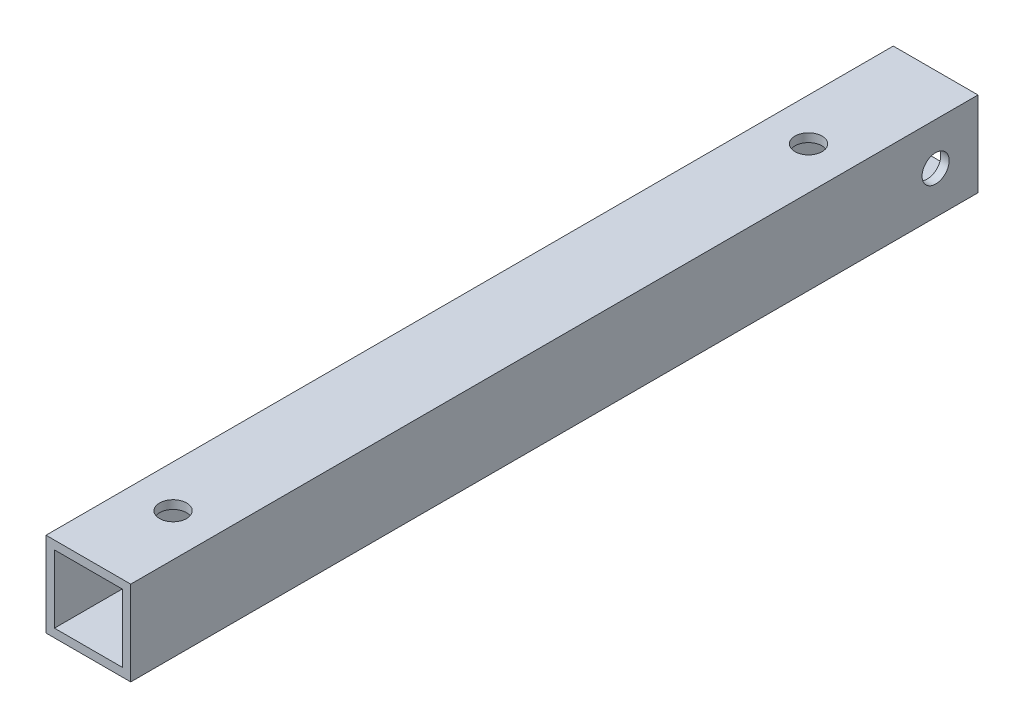
ISO-10303-21;
HEADER;
FILE_DESCRIPTION(('STEP AP214'),'2;1');
FILE_NAME('part.step','',(''),(''),'','','');
FILE_SCHEMA(('AUTOMOTIVE_DESIGN { 1 0 10303 214 1 1 1 1 }'));
ENDSEC;
DATA;
#1=APPLICATION_CONTEXT('core data for automotive mechanical design processes');
#2=APPLICATION_PROTOCOL_DEFINITION('international standard','automotive_design',2000,#1);
#3=PRODUCT_CONTEXT('',#1,'mechanical');
#4=PRODUCT('Part','Part','',(#3));
#5=PRODUCT_RELATED_PRODUCT_CATEGORY('part','',(#4));
#6=PRODUCT_DEFINITION_FORMATION('','',#4);
#7=PRODUCT_DEFINITION_CONTEXT('part definition',#1,'design');
#8=PRODUCT_DEFINITION('design','',#6,#7);
#9=PRODUCT_DEFINITION_SHAPE('','',#8);
#10=(LENGTH_UNIT() NAMED_UNIT(*) SI_UNIT(.MILLI.,.METRE.));
#11=(NAMED_UNIT(*) PLANE_ANGLE_UNIT() SI_UNIT($,.RADIAN.));
#12=(NAMED_UNIT(*) SI_UNIT($,.STERADIAN.) SOLID_ANGLE_UNIT());
#13=UNCERTAINTY_MEASURE_WITH_UNIT(LENGTH_MEASURE(1.E-05),#10,'distance_accuracy_value','');
#14=(GEOMETRIC_REPRESENTATION_CONTEXT(3) GLOBAL_UNCERTAINTY_ASSIGNED_CONTEXT((#13)) GLOBAL_UNIT_ASSIGNED_CONTEXT((#10,
#11,#12)) REPRESENTATION_CONTEXT('',''));
#15=CARTESIAN_POINT('',(0.,0.,0.));
#16=DIRECTION('',(0.,0.,1.));
#17=DIRECTION('',(1.,0.,0.));
#18=AXIS2_PLACEMENT_3D('',#15,#16,#17);
#19=CARTESIAN_POINT('',(0.,0.,100.));
#20=DIRECTION('',(0.,0.,1.));
#21=DIRECTION('',(1.,0.,0.));
#22=AXIS2_PLACEMENT_3D('',#19,#20,#21);
#23=PLANE('',#22);
#24=DIRECTION('',(0.,1.,0.));
#25=VECTOR('',#24,1.);
#26=CARTESIAN_POINT('',(5.,5.,100.));
#27=LINE('',#26,#25);
#28=CARTESIAN_POINT('',(5.,-5.,100.));
#29=VERTEX_POINT('',#28);
#30=CARTESIAN_POINT('',(5.,5.,100.));
#31=VERTEX_POINT('',#30);
#32=EDGE_CURVE('E140',#29,#31,#27,.T.);
#33=ORIENTED_EDGE('',*,*,#32,.T.);
#34=DIRECTION('',(-1.,0.,0.));
#35=VECTOR('',#34,1.);
#36=CARTESIAN_POINT('',(-5.,5.,100.));
#37=LINE('',#36,#35);
#38=CARTESIAN_POINT('',(-5.,5.,100.));
#39=VERTEX_POINT('',#38);
#40=EDGE_CURVE('E143',#31,#39,#37,.T.);
#41=ORIENTED_EDGE('',*,*,#40,.T.);
#42=DIRECTION('',(0.,-1.,0.));
#43=VECTOR('',#42,1.);
#44=CARTESIAN_POINT('',(-5.,5.,100.));
#45=LINE('',#44,#43);
#46=CARTESIAN_POINT('',(-5.,-5.,100.));
#47=VERTEX_POINT('',#46);
#48=EDGE_CURVE('E146',#39,#47,#45,.T.);
#49=ORIENTED_EDGE('',*,*,#48,.T.);
#50=DIRECTION('',(1.,0.,0.));
#51=VECTOR('',#50,1.);
#52=CARTESIAN_POINT('',(-5.,-5.,100.));
#53=LINE('',#52,#51);
#54=EDGE_CURVE('E148',#47,#29,#53,.T.);
#55=ORIENTED_EDGE('',*,*,#54,.T.);
#56=EDGE_LOOP('',(#33,#41,#49,#55));
#57=FACE_BOUND('',#56,.T.);
#58=DIRECTION('',(0.,-1.,0.));
#59=VECTOR('',#58,1.);
#60=CARTESIAN_POINT('',(-4.,4.,100.));
#61=LINE('',#60,#59);
#62=CARTESIAN_POINT('',(-4.,4.,100.));
#63=VERTEX_POINT('',#62);
#64=CARTESIAN_POINT('',(-4.,-4.,100.));
#65=VERTEX_POINT('',#64);
#66=EDGE_CURVE('E110',#63,#65,#61,.T.);
#67=ORIENTED_EDGE('',*,*,#66,.F.);
#68=DIRECTION('',(-1.,0.,0.));
#69=VECTOR('',#68,1.);
#70=CARTESIAN_POINT('',(-4.,4.,100.));
#71=LINE('',#70,#69);
#72=CARTESIAN_POINT('',(4.,4.,100.));
#73=VERTEX_POINT('',#72);
#74=EDGE_CURVE('E102',#73,#63,#71,.T.);
#75=ORIENTED_EDGE('',*,*,#74,.F.);
#76=DIRECTION('',(0.,1.,0.));
#77=VECTOR('',#76,1.);
#78=CARTESIAN_POINT('',(4.,4.,100.));
#79=LINE('',#78,#77);
#80=CARTESIAN_POINT('',(4.,-4.,100.));
#81=VERTEX_POINT('',#80);
#82=EDGE_CURVE('E124',#81,#73,#79,.T.);
#83=ORIENTED_EDGE('',*,*,#82,.F.);
#84=DIRECTION('',(1.,0.,0.));
#85=VECTOR('',#84,1.);
#86=CARTESIAN_POINT('',(-4.,-4.,100.));
#87=LINE('',#86,#85);
#88=EDGE_CURVE('E122',#65,#81,#87,.T.);
#89=ORIENTED_EDGE('',*,*,#88,.F.);
#90=EDGE_LOOP('',(#67,#75,#83,#89));
#91=FACE_BOUND('',#90,.T.);
#92=ADVANCED_FACE('F35',(#57,#91),#23,.T.);
#93=CARTESIAN_POINT('',(0.,0.,0.));
#94=DIRECTION('',(0.,0.,1.));
#95=DIRECTION('',(1.,0.,0.));
#96=AXIS2_PLACEMENT_3D('',#93,#94,#95);
#97=PLANE('',#96);
#98=DIRECTION('',(0.,1.,0.));
#99=VECTOR('',#98,1.);
#100=CARTESIAN_POINT('',(5.,5.,0.));
#101=LINE('',#100,#99);
#102=CARTESIAN_POINT('',(5.,-5.,0.));
#103=VERTEX_POINT('',#102);
#104=CARTESIAN_POINT('',(5.,5.,0.));
#105=VERTEX_POINT('',#104);
#106=EDGE_CURVE('E118',#103,#105,#101,.T.);
#107=ORIENTED_EDGE('',*,*,#106,.F.);
#108=DIRECTION('',(1.,0.,0.));
#109=VECTOR('',#108,1.);
#110=CARTESIAN_POINT('',(-5.,-5.,0.));
#111=LINE('',#110,#109);
#112=CARTESIAN_POINT('',(-5.,-5.,0.));
#113=VERTEX_POINT('',#112);
#114=EDGE_CURVE('E144',#113,#103,#111,.T.);
#115=ORIENTED_EDGE('',*,*,#114,.F.);
#116=DIRECTION('',(0.,-1.,0.));
#117=VECTOR('',#116,1.);
#118=CARTESIAN_POINT('',(-5.,5.,0.));
#119=LINE('',#118,#117);
#120=CARTESIAN_POINT('',(-5.,5.,0.));
#121=VERTEX_POINT('',#120);
#122=EDGE_CURVE('E155',#121,#113,#119,.T.);
#123=ORIENTED_EDGE('',*,*,#122,.F.);
#124=DIRECTION('',(-1.,0.,0.));
#125=VECTOR('',#124,1.);
#126=CARTESIAN_POINT('',(-5.,5.,0.));
#127=LINE('',#126,#125);
#128=EDGE_CURVE('E153',#105,#121,#127,.T.);
#129=ORIENTED_EDGE('',*,*,#128,.F.);
#130=EDGE_LOOP('',(#107,#115,#123,#129));
#131=FACE_BOUND('',#130,.T.);
#132=DIRECTION('',(-1.,0.,0.));
#133=VECTOR('',#132,1.);
#134=CARTESIAN_POINT('',(-4.,4.,0.));
#135=LINE('',#134,#133);
#136=CARTESIAN_POINT('',(4.,4.,0.));
#137=VERTEX_POINT('',#136);
#138=CARTESIAN_POINT('',(-4.,4.,0.));
#139=VERTEX_POINT('',#138);
#140=EDGE_CURVE('E60',#137,#139,#135,.T.);
#141=ORIENTED_EDGE('',*,*,#140,.T.);
#142=DIRECTION('',(0.,-1.,0.));
#143=VECTOR('',#142,1.);
#144=CARTESIAN_POINT('',(-4.,4.,0.));
#145=LINE('',#144,#143);
#146=CARTESIAN_POINT('',(-4.,-4.,0.));
#147=VERTEX_POINT('',#146);
#148=EDGE_CURVE('E117',#139,#147,#145,.T.);
#149=ORIENTED_EDGE('',*,*,#148,.T.);
#150=DIRECTION('',(1.,0.,0.));
#151=VECTOR('',#150,1.);
#152=CARTESIAN_POINT('',(-4.,-4.,0.));
#153=LINE('',#152,#151);
#154=CARTESIAN_POINT('',(4.,-4.,0.));
#155=VERTEX_POINT('',#154);
#156=EDGE_CURVE('E132',#147,#155,#153,.T.);
#157=ORIENTED_EDGE('',*,*,#156,.T.);
#158=DIRECTION('',(0.,1.,0.));
#159=VECTOR('',#158,1.);
#160=CARTESIAN_POINT('',(4.,4.,0.));
#161=LINE('',#160,#159);
#162=EDGE_CURVE('E111',#155,#137,#161,.T.);
#163=ORIENTED_EDGE('',*,*,#162,.T.);
#164=EDGE_LOOP('',(#141,#149,#157,#163));
#165=FACE_BOUND('',#164,.T.);
#166=ADVANCED_FACE('F211',(#131,#165),#97,.F.);
#167=CARTESIAN_POINT('',(5.,5.,100.));
#168=DIRECTION('',(-1.,0.,0.));
#169=DIRECTION('',(0.,-1.,0.));
#170=AXIS2_PLACEMENT_3D('',#167,#168,#169);
#171=PLANE('',#170);
#172=CARTESIAN_POINT('',(5.,0.,5.));
#173=DIRECTION('',(-1.,0.,0.));
#174=DIRECTION('',(0.,-1.,0.));
#175=AXIS2_PLACEMENT_3D('',#172,#173,#174);
#176=CIRCLE('',#175,1.6);
#177=CARTESIAN_POINT('',(5.,-1.6,5.));
#178=VERTEX_POINT('',#177);
#179=EDGE_CURVE('E167',#178,#178,#176,.T.);
#180=ORIENTED_EDGE('',*,*,#179,.T.);
#181=EDGE_LOOP('',(#180));
#182=FACE_BOUND('',#181,.T.);
#183=ORIENTED_EDGE('',*,*,#106,.T.);
#184=DIRECTION('',(0.,0.,-1.));
#185=VECTOR('',#184,1.);
#186=CARTESIAN_POINT('',(5.,5.,100.));
#187=LINE('',#186,#185);
#188=EDGE_CURVE('E11',#31,#105,#187,.T.);
#189=ORIENTED_EDGE('',*,*,#188,.F.);
#190=ORIENTED_EDGE('',*,*,#32,.F.);
#191=DIRECTION('',(0.,0.,-1.));
#192=VECTOR('',#191,1.);
#193=CARTESIAN_POINT('',(5.,-5.,100.));
#194=LINE('',#193,#192);
#195=EDGE_CURVE('E150',#29,#103,#194,.T.);
#196=ORIENTED_EDGE('',*,*,#195,.T.);
#197=EDGE_LOOP('',(#183,#189,#190,#196));
#198=FACE_BOUND('',#197,.T.);
#199=ADVANCED_FACE('F37',(#182,#198),#171,.F.);
#200=CARTESIAN_POINT('',(-5.,5.,100.));
#201=DIRECTION('',(0.,-1.,0.));
#202=DIRECTION('',(0.,0.,-1.));
#203=AXIS2_PLACEMENT_3D('',#200,#201,#202);
#204=PLANE('',#203);
#205=CARTESIAN_POINT('',(0.,5.,15.));
#206=DIRECTION('',(0.,1.,0.));
#207=DIRECTION('',(0.,0.,1.));
#208=AXIS2_PLACEMENT_3D('',#205,#206,#207);
#209=CIRCLE('',#208,1.6);
#210=CARTESIAN_POINT('',(0.,5.,16.6));
#211=VERTEX_POINT('',#210);
#212=EDGE_CURVE('E236',#211,#211,#209,.T.);
#213=ORIENTED_EDGE('',*,*,#212,.F.);
#214=EDGE_LOOP('',(#213));
#215=FACE_BOUND('',#214,.T.);
#216=CARTESIAN_POINT('',(0.,5.,90.));
#217=DIRECTION('',(0.,1.,0.));
#218=DIRECTION('',(0.,0.,1.));
#219=AXIS2_PLACEMENT_3D('',#216,#217,#218);
#220=CIRCLE('',#219,1.60000000000001);
#221=CARTESIAN_POINT('',(0.,5.,91.6));
#222=VERTEX_POINT('',#221);
#223=EDGE_CURVE('E178',#222,#222,#220,.T.);
#224=ORIENTED_EDGE('',*,*,#223,.F.);
#225=EDGE_LOOP('',(#224));
#226=FACE_BOUND('',#225,.T.);
#227=ORIENTED_EDGE('',*,*,#128,.T.);
#228=DIRECTION('',(0.,0.,-1.));
#229=VECTOR('',#228,1.);
#230=CARTESIAN_POINT('',(-5.,5.,100.));
#231=LINE('',#230,#229);
#232=EDGE_CURVE('E44',#39,#121,#231,.T.);
#233=ORIENTED_EDGE('',*,*,#232,.F.);
#234=ORIENTED_EDGE('',*,*,#40,.F.);
#235=ORIENTED_EDGE('',*,*,#188,.T.);
#236=EDGE_LOOP('',(#227,#233,#234,#235));
#237=FACE_BOUND('',#236,.T.);
#238=ADVANCED_FACE('F225',(#215,#226,#237),#204,.F.);
#239=CARTESIAN_POINT('',(-5.,5.,100.));
#240=DIRECTION('',(1.,0.,0.));
#241=DIRECTION('',(0.,1.,0.));
#242=AXIS2_PLACEMENT_3D('',#239,#240,#241);
#243=PLANE('',#242);
#244=CARTESIAN_POINT('',(-5.,0.,5.));
#245=DIRECTION('',(-1.,0.,0.));
#246=DIRECTION('',(0.,-1.,0.));
#247=AXIS2_PLACEMENT_3D('',#244,#245,#246);
#248=CIRCLE('',#247,1.6);
#249=CARTESIAN_POINT('',(-5.,-1.6,5.));
#250=VERTEX_POINT('',#249);
#251=EDGE_CURVE('E175',#250,#250,#248,.T.);
#252=ORIENTED_EDGE('',*,*,#251,.F.);
#253=EDGE_LOOP('',(#252));
#254=FACE_BOUND('',#253,.T.);
#255=ORIENTED_EDGE('',*,*,#122,.T.);
#256=DIRECTION('',(0.,0.,-1.));
#257=VECTOR('',#256,1.);
#258=CARTESIAN_POINT('',(-5.,-5.,100.));
#259=LINE('',#258,#257);
#260=EDGE_CURVE('E160',#47,#113,#259,.T.);
#261=ORIENTED_EDGE('',*,*,#260,.F.);
#262=ORIENTED_EDGE('',*,*,#48,.F.);
#263=ORIENTED_EDGE('',*,*,#232,.T.);
#264=EDGE_LOOP('',(#255,#261,#262,#263));
#265=FACE_BOUND('',#264,.T.);
#266=ADVANCED_FACE('F222',(#254,#265),#243,.F.);
#267=CARTESIAN_POINT('',(-5.,-5.,100.));
#268=DIRECTION('',(0.,1.,0.));
#269=DIRECTION('',(0.,0.,1.));
#270=AXIS2_PLACEMENT_3D('',#267,#268,#269);
#271=PLANE('',#270);
#272=CARTESIAN_POINT('',(0.,-5.,15.));
#273=DIRECTION('',(0.,1.,0.));
#274=DIRECTION('',(0.,0.,1.));
#275=AXIS2_PLACEMENT_3D('',#272,#273,#274);
#276=CIRCLE('',#275,1.6);
#277=CARTESIAN_POINT('',(0.,-5.,16.6));
#278=VERTEX_POINT('',#277);
#279=EDGE_CURVE('E284',#278,#278,#276,.T.);
#280=ORIENTED_EDGE('',*,*,#279,.T.);
#281=EDGE_LOOP('',(#280));
#282=FACE_BOUND('',#281,.T.);
#283=CARTESIAN_POINT('',(0.,-5.,90.));
#284=DIRECTION('',(0.,1.,0.));
#285=DIRECTION('',(0.,0.,1.));
#286=AXIS2_PLACEMENT_3D('',#283,#284,#285);
#287=CIRCLE('',#286,1.60000000000001);
#288=CARTESIAN_POINT('',(0.,-5.,91.6));
#289=VERTEX_POINT('',#288);
#290=EDGE_CURVE('E171',#289,#289,#287,.T.);
#291=ORIENTED_EDGE('',*,*,#290,.T.);
#292=EDGE_LOOP('',(#291));
#293=FACE_BOUND('',#292,.T.);
#294=ORIENTED_EDGE('',*,*,#114,.T.);
#295=ORIENTED_EDGE('',*,*,#195,.F.);
#296=ORIENTED_EDGE('',*,*,#54,.F.);
#297=ORIENTED_EDGE('',*,*,#260,.T.);
#298=EDGE_LOOP('',(#294,#295,#296,#297));
#299=FACE_BOUND('',#298,.T.);
#300=ADVANCED_FACE('F207',(#282,#293,#299),#271,.F.);
#301=CARTESIAN_POINT('',(-4.,4.,100.));
#302=DIRECTION('',(0.,-1.,0.));
#303=DIRECTION('',(0.,0.,-1.));
#304=AXIS2_PLACEMENT_3D('',#301,#302,#303);
#305=PLANE('',#304);
#306=CARTESIAN_POINT('',(0.,4.,15.));
#307=DIRECTION('',(0.,-1.,0.));
#308=DIRECTION('',(0.,0.,-1.));
#309=AXIS2_PLACEMENT_3D('',#306,#307,#308);
#310=CIRCLE('',#309,1.6);
#311=CARTESIAN_POINT('',(0.,4.,13.4));
#312=VERTEX_POINT('',#311);
#313=EDGE_CURVE('E183',#312,#312,#310,.T.);
#314=ORIENTED_EDGE('',*,*,#313,.F.);
#315=EDGE_LOOP('',(#314));
#316=FACE_BOUND('',#315,.T.);
#317=CARTESIAN_POINT('',(0.,4.,90.));
#318=DIRECTION('',(0.,-1.,0.));
#319=DIRECTION('',(0.,0.,-1.));
#320=AXIS2_PLACEMENT_3D('',#317,#318,#319);
#321=CIRCLE('',#320,1.60000000000001);
#322=CARTESIAN_POINT('',(0.,4.,88.4));
#323=VERTEX_POINT('',#322);
#324=EDGE_CURVE('E170',#323,#323,#321,.T.);
#325=ORIENTED_EDGE('',*,*,#324,.F.);
#326=EDGE_LOOP('',(#325));
#327=FACE_BOUND('',#326,.T.);
#328=ORIENTED_EDGE('',*,*,#140,.F.);
#329=DIRECTION('',(0.,0.,-1.));
#330=VECTOR('',#329,1.);
#331=CARTESIAN_POINT('',(4.,4.,100.));
#332=LINE('',#331,#330);
#333=EDGE_CURVE('E106',#73,#137,#332,.T.);
#334=ORIENTED_EDGE('',*,*,#333,.F.);
#335=ORIENTED_EDGE('',*,*,#74,.T.);
#336=DIRECTION('',(0.,0.,-1.));
#337=VECTOR('',#336,1.);
#338=CARTESIAN_POINT('',(-4.,4.,100.));
#339=LINE('',#338,#337);
#340=EDGE_CURVE('E105',#63,#139,#339,.T.);
#341=ORIENTED_EDGE('',*,*,#340,.T.);
#342=EDGE_LOOP('',(#328,#334,#335,#341));
#343=FACE_BOUND('',#342,.T.);
#344=ADVANCED_FACE('F104',(#316,#327,#343),#305,.T.);
#345=CARTESIAN_POINT('',(-4.,4.,100.));
#346=DIRECTION('',(1.,0.,0.));
#347=DIRECTION('',(0.,1.,0.));
#348=AXIS2_PLACEMENT_3D('',#345,#346,#347);
#349=PLANE('',#348);
#350=CARTESIAN_POINT('',(-4.,0.,5.));
#351=DIRECTION('',(1.,0.,0.));
#352=DIRECTION('',(0.,1.,0.));
#353=AXIS2_PLACEMENT_3D('',#350,#351,#352);
#354=CIRCLE('',#353,1.6);
#355=CARTESIAN_POINT('',(-4.,-1.6,5.));
#356=VERTEX_POINT('',#355);
#357=EDGE_CURVE('E130',#356,#356,#354,.T.);
#358=ORIENTED_EDGE('',*,*,#357,.F.);
#359=EDGE_LOOP('',(#358));
#360=FACE_BOUND('',#359,.T.);
#361=ORIENTED_EDGE('',*,*,#148,.F.);
#362=ORIENTED_EDGE('',*,*,#340,.F.);
#363=ORIENTED_EDGE('',*,*,#66,.T.);
#364=DIRECTION('',(0.,0.,-1.));
#365=VECTOR('',#364,1.);
#366=CARTESIAN_POINT('',(-4.,-4.,100.));
#367=LINE('',#366,#365);
#368=EDGE_CURVE('E119',#65,#147,#367,.T.);
#369=ORIENTED_EDGE('',*,*,#368,.T.);
#370=EDGE_LOOP('',(#361,#362,#363,#369));
#371=FACE_BOUND('',#370,.T.);
#372=ADVANCED_FACE('F114',(#360,#371),#349,.T.);
#373=CARTESIAN_POINT('',(-4.,-4.,100.));
#374=DIRECTION('',(0.,1.,0.));
#375=DIRECTION('',(-1.,0.,0.));
#376=AXIS2_PLACEMENT_3D('',#373,#374,#375);
#377=PLANE('',#376);
#378=CARTESIAN_POINT('',(0.,-4.,15.));
#379=DIRECTION('',(0.,1.,0.));
#380=DIRECTION('',(-1.,0.,0.));
#381=AXIS2_PLACEMENT_3D('',#378,#379,#380);
#382=CIRCLE('',#381,1.6);
#383=CARTESIAN_POINT('',(-1.6,-4.,15.));
#384=VERTEX_POINT('',#383);
#385=EDGE_CURVE('E39',#384,#384,#382,.T.);
#386=ORIENTED_EDGE('',*,*,#385,.F.);
#387=EDGE_LOOP('',(#386));
#388=FACE_BOUND('',#387,.T.);
#389=CARTESIAN_POINT('',(0.,-4.,90.));
#390=DIRECTION('',(0.,1.,0.));
#391=DIRECTION('',(-1.,0.,0.));
#392=AXIS2_PLACEMENT_3D('',#389,#390,#391);
#393=CIRCLE('',#392,1.60000000000001);
#394=CARTESIAN_POINT('',(-1.60000000000001,-4.,90.));
#395=VERTEX_POINT('',#394);
#396=EDGE_CURVE('E168',#395,#395,#393,.T.);
#397=ORIENTED_EDGE('',*,*,#396,.F.);
#398=EDGE_LOOP('',(#397));
#399=FACE_BOUND('',#398,.T.);
#400=ORIENTED_EDGE('',*,*,#156,.F.);
#401=ORIENTED_EDGE('',*,*,#368,.F.);
#402=ORIENTED_EDGE('',*,*,#88,.T.);
#403=DIRECTION('',(0.,0.,-1.));
#404=VECTOR('',#403,1.);
#405=CARTESIAN_POINT('',(4.,-4.,100.));
#406=LINE('',#405,#404);
#407=EDGE_CURVE('E52',#81,#155,#406,.T.);
#408=ORIENTED_EDGE('',*,*,#407,.T.);
#409=EDGE_LOOP('',(#400,#401,#402,#408));
#410=FACE_BOUND('',#409,.T.);
#411=ADVANCED_FACE('F198',(#388,#399,#410),#377,.T.);
#412=CARTESIAN_POINT('',(4.,4.,100.));
#413=DIRECTION('',(-1.,0.,0.));
#414=DIRECTION('',(0.,-1.,0.));
#415=AXIS2_PLACEMENT_3D('',#412,#413,#414);
#416=PLANE('',#415);
#417=CARTESIAN_POINT('',(4.,0.,5.));
#418=DIRECTION('',(-1.,0.,0.));
#419=DIRECTION('',(0.,-1.,0.));
#420=AXIS2_PLACEMENT_3D('',#417,#418,#419);
#421=CIRCLE('',#420,1.6);
#422=CARTESIAN_POINT('',(4.,-1.6,5.));
#423=VERTEX_POINT('',#422);
#424=EDGE_CURVE('E165',#423,#423,#421,.T.);
#425=ORIENTED_EDGE('',*,*,#424,.F.);
#426=EDGE_LOOP('',(#425));
#427=FACE_BOUND('',#426,.T.);
#428=ORIENTED_EDGE('',*,*,#162,.F.);
#429=ORIENTED_EDGE('',*,*,#407,.F.);
#430=ORIENTED_EDGE('',*,*,#82,.T.);
#431=ORIENTED_EDGE('',*,*,#333,.T.);
#432=EDGE_LOOP('',(#428,#429,#430,#431));
#433=FACE_BOUND('',#432,.T.);
#434=ADVANCED_FACE('F204',(#427,#433),#416,.T.);
#435=CARTESIAN_POINT('',(5.,0.,5.));
#436=DIRECTION('',(-1.,0.,0.));
#437=DIRECTION('',(0.,-1.,0.));
#438=AXIS2_PLACEMENT_3D('',#435,#436,#437);
#439=CYLINDRICAL_SURFACE('',#438,1.6);
#440=CARTESIAN_POINT('',(4.,-1.6,5.));
#441=CARTESIAN_POINT('',(4.01041666666667,-1.6,5.));
#442=CARTESIAN_POINT('',(4.02083333333333,-1.6,5.));
#443=CARTESIAN_POINT('',(4.04166666666667,-1.6,5.));
#444=CARTESIAN_POINT('',(4.05208333333333,-1.6,5.));
#445=CARTESIAN_POINT('',(4.07291666666667,-1.6,5.));
#446=CARTESIAN_POINT('',(4.08333333333333,-1.6,5.));
#447=CARTESIAN_POINT('',(4.10416666666667,-1.6,5.));
#448=CARTESIAN_POINT('',(4.11458333333333,-1.6,5.));
#449=CARTESIAN_POINT('',(4.13541666666667,-1.6,5.));
#450=CARTESIAN_POINT('',(4.14583333333333,-1.6,5.));
#451=CARTESIAN_POINT('',(4.16666666666667,-1.6,5.));
#452=CARTESIAN_POINT('',(4.17708333333333,-1.6,5.));
#453=CARTESIAN_POINT('',(4.19791666666667,-1.6,5.));
#454=CARTESIAN_POINT('',(4.20833333333333,-1.6,5.));
#455=CARTESIAN_POINT('',(4.22916666666667,-1.6,5.));
#456=CARTESIAN_POINT('',(4.23958333333333,-1.6,5.));
#457=CARTESIAN_POINT('',(4.26041666666667,-1.6,5.));
#458=CARTESIAN_POINT('',(4.27083333333333,-1.6,5.));
#459=CARTESIAN_POINT('',(4.29166666666667,-1.6,5.));
#460=CARTESIAN_POINT('',(4.30208333333333,-1.6,5.));
#461=CARTESIAN_POINT('',(4.32291666666667,-1.6,5.));
#462=CARTESIAN_POINT('',(4.33333333333333,-1.6,5.));
#463=CARTESIAN_POINT('',(4.35416666666667,-1.6,5.));
#464=CARTESIAN_POINT('',(4.36458333333333,-1.6,5.));
#465=CARTESIAN_POINT('',(4.38541666666667,-1.6,5.));
#466=CARTESIAN_POINT('',(4.39583333333333,-1.6,5.));
#467=CARTESIAN_POINT('',(4.41666666666667,-1.6,5.));
#468=CARTESIAN_POINT('',(4.42708333333333,-1.6,5.));
#469=CARTESIAN_POINT('',(4.44791666666667,-1.6,5.));
#470=CARTESIAN_POINT('',(4.45833333333333,-1.6,5.));
#471=CARTESIAN_POINT('',(4.47916666666667,-1.6,5.));
#472=CARTESIAN_POINT('',(4.48958333333333,-1.6,5.));
#473=CARTESIAN_POINT('',(4.51041666666667,-1.6,5.));
#474=CARTESIAN_POINT('',(4.52083333333333,-1.6,5.));
#475=CARTESIAN_POINT('',(4.54166666666667,-1.6,5.));
#476=CARTESIAN_POINT('',(4.55208333333333,-1.6,5.));
#477=CARTESIAN_POINT('',(4.57291666666667,-1.6,5.));
#478=CARTESIAN_POINT('',(4.58333333333334,-1.6,5.));
#479=CARTESIAN_POINT('',(4.60416666666667,-1.6,5.));
#480=CARTESIAN_POINT('',(4.61458333333334,-1.6,5.));
#481=CARTESIAN_POINT('',(4.63541666666667,-1.6,5.));
#482=CARTESIAN_POINT('',(4.64583333333334,-1.6,5.));
#483=CARTESIAN_POINT('',(4.66666666666667,-1.6,5.));
#484=CARTESIAN_POINT('',(4.67708333333334,-1.6,5.));
#485=CARTESIAN_POINT('',(4.69791666666667,-1.6,5.));
#486=CARTESIAN_POINT('',(4.70833333333334,-1.6,5.));
#487=CARTESIAN_POINT('',(4.72916666666667,-1.6,5.));
#488=CARTESIAN_POINT('',(4.73958333333334,-1.6,5.));
#489=CARTESIAN_POINT('',(4.76041666666667,-1.6,5.));
#490=CARTESIAN_POINT('',(4.77083333333334,-1.6,5.));
#491=CARTESIAN_POINT('',(4.79166666666667,-1.6,5.));
#492=CARTESIAN_POINT('',(4.80208333333334,-1.6,5.));
#493=CARTESIAN_POINT('',(4.82291666666667,-1.6,5.));
#494=CARTESIAN_POINT('',(4.83333333333334,-1.6,5.));
#495=CARTESIAN_POINT('',(4.85416666666667,-1.6,5.));
#496=CARTESIAN_POINT('',(4.86458333333334,-1.6,5.));
#497=CARTESIAN_POINT('',(4.88541666666667,-1.6,5.));
#498=CARTESIAN_POINT('',(4.89583333333334,-1.6,5.));
#499=CARTESIAN_POINT('',(4.91666666666667,-1.6,5.));
#500=CARTESIAN_POINT('',(4.92708333333334,-1.6,5.));
#501=CARTESIAN_POINT('',(4.94791666666667,-1.6,5.));
#502=CARTESIAN_POINT('',(4.95833333333334,-1.6,5.));
#503=CARTESIAN_POINT('',(4.97916666666667,-1.6,5.));
#504=CARTESIAN_POINT('',(4.98958333333334,-1.6,5.));
#505=CARTESIAN_POINT('',(5.,-1.6,5.));
#506=B_SPLINE_CURVE_WITH_KNOTS('',3,(#440,#441,#442,#443,#444,#445,#446,#447,#448,#449,#450,
#451,#452,#453,#454,#455,#456,#457,#458,#459,#460,#461,#462,#463,#464,#465,#466,#467,#468,#469,
#470,#471,#472,#473,#474,#475,#476,#477,#478,#479,#480,#481,#482,#483,#484,#485,#486,#487,#488,
#489,#490,#491,#492,#493,#494,#495,#496,#497,#498,#499,#500,#501,#502,#503,#504,#505),
.UNSPECIFIED.,.F.,.F.,(4,2,2,2,2,2,2,2,2,2,2,2,2,2,2,2,2,2,2,2,2,2,2,2,2,2,2,2,2,2,2,2,4),(0.,
0.03125,0.0625000000000001,0.0937500000000009,0.125000000000001,0.156250000000001,
0.187500000000001,0.218750000000001,0.250000000000001,0.281250000000001,0.312500000000001,
0.343750000000002,0.375000000000002,0.406250000000002,0.437500000000002,0.468750000000002,
0.500000000000002,0.531250000000002,0.562500000000003,0.593750000000003,0.625000000000003,
0.656250000000003,0.687500000000003,0.718750000000003,0.750000000000003,0.781250000000004,
0.812500000000004,0.843750000000004,0.875000000000004,0.906250000000004,0.937500000000004,
0.968750000000004,1.),.UNSPECIFIED.);
#507=EDGE_CURVE('BSEAM255',#423,#178,#506,.T.);
#508=ORIENTED_EDGE('',*,*,#424,.T.);
#509=ORIENTED_EDGE('',*,*,#179,.F.);
#510=ORIENTED_EDGE('',*,*,#507,.T.);
#511=ORIENTED_EDGE('',*,*,#507,.F.);
#512=EDGE_LOOP('',(#508,#510,#509,#511));
#513=FACE_BOUND('',#512,.T.);
#514=ADVANCED_FACE('F255',(#513),#439,.F.);
#515=CARTESIAN_POINT('',(-4.,-1.6,5.));
#516=CARTESIAN_POINT('',(-4.01041666666667,-1.6,5.));
#517=CARTESIAN_POINT('',(-4.02083333333333,-1.6,5.));
#518=CARTESIAN_POINT('',(-4.04166666666667,-1.6,5.));
#519=CARTESIAN_POINT('',(-4.05208333333333,-1.6,5.));
#520=CARTESIAN_POINT('',(-4.07291666666667,-1.6,5.));
#521=CARTESIAN_POINT('',(-4.08333333333333,-1.6,5.));
#522=CARTESIAN_POINT('',(-4.10416666666667,-1.6,5.));
#523=CARTESIAN_POINT('',(-4.11458333333333,-1.6,5.));
#524=CARTESIAN_POINT('',(-4.13541666666667,-1.6,5.));
#525=CARTESIAN_POINT('',(-4.14583333333333,-1.6,5.));
#526=CARTESIAN_POINT('',(-4.16666666666667,-1.6,5.));
#527=CARTESIAN_POINT('',(-4.17708333333333,-1.6,5.));
#528=CARTESIAN_POINT('',(-4.19791666666667,-1.6,5.));
#529=CARTESIAN_POINT('',(-4.20833333333333,-1.6,5.));
#530=CARTESIAN_POINT('',(-4.22916666666667,-1.6,5.));
#531=CARTESIAN_POINT('',(-4.23958333333333,-1.6,5.));
#532=CARTESIAN_POINT('',(-4.26041666666667,-1.6,5.));
#533=CARTESIAN_POINT('',(-4.27083333333333,-1.6,5.));
#534=CARTESIAN_POINT('',(-4.29166666666667,-1.6,5.));
#535=CARTESIAN_POINT('',(-4.30208333333333,-1.6,5.));
#536=CARTESIAN_POINT('',(-4.32291666666667,-1.6,5.));
#537=CARTESIAN_POINT('',(-4.33333333333333,-1.6,5.));
#538=CARTESIAN_POINT('',(-4.35416666666667,-1.6,5.));
#539=CARTESIAN_POINT('',(-4.36458333333333,-1.6,5.));
#540=CARTESIAN_POINT('',(-4.38541666666667,-1.6,5.));
#541=CARTESIAN_POINT('',(-4.39583333333333,-1.6,5.));
#542=CARTESIAN_POINT('',(-4.41666666666667,-1.6,5.));
#543=CARTESIAN_POINT('',(-4.42708333333333,-1.6,5.));
#544=CARTESIAN_POINT('',(-4.44791666666667,-1.6,5.));
#545=CARTESIAN_POINT('',(-4.45833333333333,-1.6,5.));
#546=CARTESIAN_POINT('',(-4.47916666666667,-1.6,5.));
#547=CARTESIAN_POINT('',(-4.48958333333333,-1.6,5.));
#548=CARTESIAN_POINT('',(-4.51041666666667,-1.6,5.));
#549=CARTESIAN_POINT('',(-4.52083333333333,-1.6,5.));
#550=CARTESIAN_POINT('',(-4.54166666666667,-1.6,5.));
#551=CARTESIAN_POINT('',(-4.55208333333333,-1.6,5.));
#552=CARTESIAN_POINT('',(-4.57291666666667,-1.6,5.));
#553=CARTESIAN_POINT('',(-4.58333333333333,-1.6,5.));
#554=CARTESIAN_POINT('',(-4.60416666666667,-1.6,5.));
#555=CARTESIAN_POINT('',(-4.61458333333333,-1.6,5.));
#556=CARTESIAN_POINT('',(-4.63541666666667,-1.6,5.));
#557=CARTESIAN_POINT('',(-4.64583333333333,-1.6,5.));
#558=CARTESIAN_POINT('',(-4.66666666666667,-1.6,5.));
#559=CARTESIAN_POINT('',(-4.67708333333333,-1.6,5.));
#560=CARTESIAN_POINT('',(-4.69791666666667,-1.6,5.));
#561=CARTESIAN_POINT('',(-4.70833333333333,-1.6,5.));
#562=CARTESIAN_POINT('',(-4.72916666666667,-1.6,5.));
#563=CARTESIAN_POINT('',(-4.73958333333333,-1.6,5.));
#564=CARTESIAN_POINT('',(-4.76041666666667,-1.6,5.));
#565=CARTESIAN_POINT('',(-4.77083333333333,-1.6,5.));
#566=CARTESIAN_POINT('',(-4.79166666666667,-1.6,5.));
#567=CARTESIAN_POINT('',(-4.80208333333333,-1.6,5.));
#568=CARTESIAN_POINT('',(-4.82291666666667,-1.6,5.));
#569=CARTESIAN_POINT('',(-4.83333333333333,-1.6,5.));
#570=CARTESIAN_POINT('',(-4.85416666666667,-1.6,5.));
#571=CARTESIAN_POINT('',(-4.86458333333333,-1.6,5.));
#572=CARTESIAN_POINT('',(-4.88541666666667,-1.6,5.));
#573=CARTESIAN_POINT('',(-4.89583333333333,-1.6,5.));
#574=CARTESIAN_POINT('',(-4.91666666666667,-1.6,5.));
#575=CARTESIAN_POINT('',(-4.92708333333333,-1.6,5.));
#576=CARTESIAN_POINT('',(-4.94791666666667,-1.6,5.));
#577=CARTESIAN_POINT('',(-4.95833333333333,-1.6,5.));
#578=CARTESIAN_POINT('',(-4.97916666666667,-1.6,5.));
#579=CARTESIAN_POINT('',(-4.98958333333333,-1.6,5.));
#580=CARTESIAN_POINT('',(-5.,-1.6,5.));
#581=B_SPLINE_CURVE_WITH_KNOTS('',3,(#515,#516,#517,#518,#519,#520,#521,#522,#523,#524,#525,
#526,#527,#528,#529,#530,#531,#532,#533,#534,#535,#536,#537,#538,#539,#540,#541,#542,#543,#544,
#545,#546,#547,#548,#549,#550,#551,#552,#553,#554,#555,#556,#557,#558,#559,#560,#561,#562,#563,
#564,#565,#566,#567,#568,#569,#570,#571,#572,#573,#574,#575,#576,#577,#578,#579,#580),
.UNSPECIFIED.,.F.,.F.,(4,2,2,2,2,2,2,2,2,2,2,2,2,2,2,2,2,2,2,2,2,2,2,2,2,2,2,2,2,2,2,2,4),(0.,
0.03125,0.0625000000000001,0.0937500000000001,0.125,0.15625,0.1875,0.21875,0.25,0.28125,0.3125,
0.34375,0.375,0.40625,0.4375,0.46875,0.5,0.53125,0.5625,0.593750000000001,0.625000000000001,
0.656250000000001,0.687500000000001,0.718750000000001,0.750000000000001,0.781250000000001,
0.812500000000001,0.843750000000001,0.875000000000001,0.906250000000001,0.937500000000001,
0.968750000000001,1.),.UNSPECIFIED.);
#582=EDGE_CURVE('BSEAM194',#356,#250,#581,.T.);
#583=ORIENTED_EDGE('',*,*,#357,.T.);
#584=ORIENTED_EDGE('',*,*,#251,.T.);
#585=ORIENTED_EDGE('',*,*,#582,.T.);
#586=ORIENTED_EDGE('',*,*,#582,.F.);
#587=EDGE_LOOP('',(#583,#585,#584,#586));
#588=FACE_BOUND('',#587,.T.);
#589=ADVANCED_FACE('F194',(#588),#439,.F.);
#590=CARTESIAN_POINT('',(0.,-5.,90.));
#591=DIRECTION('',(0.,1.,0.));
#592=DIRECTION('',(0.,0.,1.));
#593=AXIS2_PLACEMENT_3D('',#590,#591,#592);
#594=CYLINDRICAL_SURFACE('',#593,1.60000000000001);
#595=ORIENTED_EDGE('',*,*,#396,.T.);
#596=EDGE_LOOP('',(#595));
#597=FACE_BOUND('',#596,.T.);
#598=ORIENTED_EDGE('',*,*,#290,.F.);
#599=EDGE_LOOP('',(#598));
#600=FACE_BOUND('',#599,.T.);
#601=ADVANCED_FACE('F265',(#597,#600),#594,.F.);
#602=ORIENTED_EDGE('',*,*,#324,.T.);
#603=EDGE_LOOP('',(#602));
#604=FACE_BOUND('',#603,.T.);
#605=ORIENTED_EDGE('',*,*,#223,.T.);
#606=EDGE_LOOP('',(#605));
#607=FACE_BOUND('',#606,.T.);
#608=ADVANCED_FACE('F268',(#604,#607),#594,.F.);
#609=CARTESIAN_POINT('',(0.,-5.,15.));
#610=DIRECTION('',(0.,1.,0.));
#611=DIRECTION('',(0.,0.,1.));
#612=AXIS2_PLACEMENT_3D('',#609,#610,#611);
#613=CYLINDRICAL_SURFACE('',#612,1.6);
#614=ORIENTED_EDGE('',*,*,#385,.T.);
#615=EDGE_LOOP('',(#614));
#616=FACE_BOUND('',#615,.T.);
#617=ORIENTED_EDGE('',*,*,#279,.F.);
#618=EDGE_LOOP('',(#617));
#619=FACE_BOUND('',#618,.T.);
#620=ADVANCED_FACE('F269',(#616,#619),#613,.F.);
#621=ORIENTED_EDGE('',*,*,#313,.T.);
#622=EDGE_LOOP('',(#621));
#623=FACE_BOUND('',#622,.T.);
#624=ORIENTED_EDGE('',*,*,#212,.T.);
#625=EDGE_LOOP('',(#624));
#626=FACE_BOUND('',#625,.T.);
#627=ADVANCED_FACE('F271',(#623,#626),#613,.F.);
#628=CLOSED_SHELL('',(#92,#166,#199,#238,#266,#300,#344,#372,#411,#434,#514,#589,#601,#608,#620,#627));
#629=MANIFOLD_SOLID_BREP('B2',#628);
#630=ADVANCED_BREP_SHAPE_REPRESENTATION('',(#18,#629),#14);
#631=SHAPE_DEFINITION_REPRESENTATION(#9,#630);
ENDSEC;
END-ISO-10303-21;
